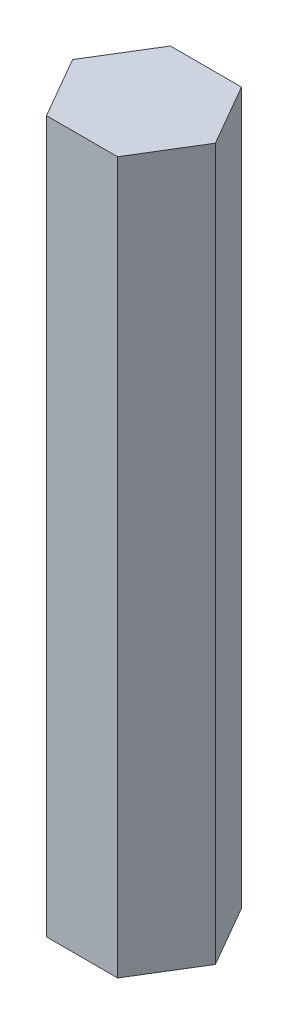
ISO-10303-21;
HEADER;
FILE_DESCRIPTION(('STEP AP214'),'2;1');
FILE_NAME('part.step','',(''),(''),'','','');
FILE_SCHEMA(('AUTOMOTIVE_DESIGN { 1 0 10303 214 1 1 1 1 }'));
ENDSEC;
DATA;
#1=APPLICATION_CONTEXT('core data for automotive mechanical design processes');
#2=APPLICATION_PROTOCOL_DEFINITION('international standard','automotive_design',2000,#1);
#3=PRODUCT_CONTEXT('',#1,'mechanical');
#4=PRODUCT('Part','Part','',(#3));
#5=PRODUCT_RELATED_PRODUCT_CATEGORY('part','',(#4));
#6=PRODUCT_DEFINITION_FORMATION('','',#4);
#7=PRODUCT_DEFINITION_CONTEXT('part definition',#1,'design');
#8=PRODUCT_DEFINITION('design','',#6,#7);
#9=PRODUCT_DEFINITION_SHAPE('','',#8);
#10=(LENGTH_UNIT() NAMED_UNIT(*) SI_UNIT(.MILLI.,.METRE.));
#11=(NAMED_UNIT(*) PLANE_ANGLE_UNIT() SI_UNIT($,.RADIAN.));
#12=(NAMED_UNIT(*) SI_UNIT($,.STERADIAN.) SOLID_ANGLE_UNIT());
#13=UNCERTAINTY_MEASURE_WITH_UNIT(LENGTH_MEASURE(1.E-05),#10,'distance_accuracy_value','');
#14=(GEOMETRIC_REPRESENTATION_CONTEXT(3) GLOBAL_UNCERTAINTY_ASSIGNED_CONTEXT((#13)) GLOBAL_UNIT_ASSIGNED_CONTEXT((#10,
#11,#12)) REPRESENTATION_CONTEXT('',''));
#15=CARTESIAN_POINT('',(0.,0.,0.));
#16=DIRECTION('',(0.,0.,1.));
#17=DIRECTION('',(1.,0.,0.));
#18=AXIS2_PLACEMENT_3D('',#15,#16,#17);
#19=CARTESIAN_POINT('',(-1.24930613372395,25.,-2.1654639651215));
#20=DIRECTION('',(0.8661855860486,0.,-0.499722453489578));
#21=DIRECTION('',(-0.499722453489578,0.,-0.8661855860486));
#22=AXIS2_PLACEMENT_3D('',#19,#20,#21);
#23=PLANE('',#22);
#24=DIRECTION('',(0.499722453489578,0.,0.8661855860486));
#25=VECTOR('',#24,1.);
#26=CARTESIAN_POINT('',(-1.24930613372395,0.,-2.1654639651215));
#27=LINE('',#26,#25);
#28=CARTESIAN_POINT('',(-1.24930613372395,0.,-2.1654639651215));
#29=VERTEX_POINT('',#28);
#30=CARTESIAN_POINT('',(0.,0.,0.));
#31=VERTEX_POINT('',#30);
#32=EDGE_CURVE('E119',#29,#31,#27,.T.);
#33=ORIENTED_EDGE('',*,*,#32,.T.);
#34=DIRECTION('',(0.,-1.,0.));
#35=VECTOR('',#34,1.);
#36=CARTESIAN_POINT('',(0.,25.,0.));
#37=LINE('',#36,#35);
#38=CARTESIAN_POINT('',(0.,25.,0.));
#39=VERTEX_POINT('',#38);
#40=EDGE_CURVE('E11',#39,#31,#37,.T.);
#41=ORIENTED_EDGE('',*,*,#40,.F.);
#42=DIRECTION('',(0.499722453489578,0.,0.8661855860486));
#43=VECTOR('',#42,1.);
#44=CARTESIAN_POINT('',(-1.24930613372395,25.,-2.1654639651215));
#45=LINE('',#44,#43);
#46=CARTESIAN_POINT('',(-1.24930613372395,25.,-2.1654639651215));
#47=VERTEX_POINT('',#46);
#48=EDGE_CURVE('E129',#47,#39,#45,.T.);
#49=ORIENTED_EDGE('',*,*,#48,.F.);
#50=DIRECTION('',(0.,-1.,0.));
#51=VECTOR('',#50,1.);
#52=CARTESIAN_POINT('',(-1.24930613372395,25.,-2.1654639651215));
#53=LINE('',#52,#51);
#54=EDGE_CURVE('E115',#47,#29,#53,.T.);
#55=ORIENTED_EDGE('',*,*,#54,.T.);
#56=EDGE_LOOP('',(#33,#41,#49,#55));
#57=FACE_BOUND('',#56,.T.);
#58=ADVANCED_FACE('F35',(#57),#23,.F.);
#59=CARTESIAN_POINT('',(0.,25.,0.));
#60=DIRECTION('',(0.,0.,-1.));
#61=DIRECTION('',(-1.,0.,0.));
#62=AXIS2_PLACEMENT_3D('',#59,#60,#61);
#63=PLANE('',#62);
#64=DIRECTION('',(1.,0.,0.));
#65=VECTOR('',#64,1.);
#66=CARTESIAN_POINT('',(0.,0.,0.));
#67=LINE('',#66,#65);
#68=CARTESIAN_POINT('',(2.5,0.,0.));
#69=VERTEX_POINT('',#68);
#70=EDGE_CURVE('E122',#31,#69,#67,.T.);
#71=ORIENTED_EDGE('',*,*,#70,.T.);
#72=DIRECTION('',(0.,-1.,0.));
#73=VECTOR('',#72,1.);
#74=CARTESIAN_POINT('',(2.5,25.,0.));
#75=LINE('',#74,#73);
#76=CARTESIAN_POINT('',(2.5,25.,0.));
#77=VERTEX_POINT('',#76);
#78=EDGE_CURVE('E43',#77,#69,#75,.T.);
#79=ORIENTED_EDGE('',*,*,#78,.F.);
#80=DIRECTION('',(1.,0.,0.));
#81=VECTOR('',#80,1.);
#82=CARTESIAN_POINT('',(0.,25.,0.));
#83=LINE('',#82,#81);
#84=EDGE_CURVE('E88',#39,#77,#83,.T.);
#85=ORIENTED_EDGE('',*,*,#84,.F.);
#86=ORIENTED_EDGE('',*,*,#40,.T.);
#87=EDGE_LOOP('',(#71,#79,#85,#86));
#88=FACE_BOUND('',#87,.T.);
#89=ADVANCED_FACE('F153',(#88),#63,.F.);
#90=CARTESIAN_POINT('',(2.5,25.,0.));
#91=DIRECTION('',(-0.852851304076264,0.,-0.522153859638532));
#92=DIRECTION('',(-0.522153859638532,0.,0.852851304076264));
#93=AXIS2_PLACEMENT_3D('',#90,#91,#92);
#94=PLANE('',#93);
#95=DIRECTION('',(0.522153859638532,0.,-0.852851304076264));
#96=VECTOR('',#95,1.);
#97=CARTESIAN_POINT('',(2.5,0.,0.));
#98=LINE('',#97,#96);
#99=CARTESIAN_POINT('',(3.80538464909633,0.,-2.13212826019066));
#100=VERTEX_POINT('',#99);
#101=EDGE_CURVE('E124',#69,#100,#98,.T.);
#102=ORIENTED_EDGE('',*,*,#101,.T.);
#103=DIRECTION('',(0.,-1.,0.));
#104=VECTOR('',#103,1.);
#105=CARTESIAN_POINT('',(3.80538464909633,25.,-2.13212826019066));
#106=LINE('',#105,#104);
#107=CARTESIAN_POINT('',(3.80538464909633,25.,-2.13212826019066));
#108=VERTEX_POINT('',#107);
#109=EDGE_CURVE('E110',#108,#100,#106,.T.);
#110=ORIENTED_EDGE('',*,*,#109,.F.);
#111=DIRECTION('',(0.522153859638532,0.,-0.852851304076264));
#112=VECTOR('',#111,1.);
#113=CARTESIAN_POINT('',(2.5,25.,0.));
#114=LINE('',#113,#112);
#115=EDGE_CURVE('E101',#77,#108,#114,.T.);
#116=ORIENTED_EDGE('',*,*,#115,.F.);
#117=ORIENTED_EDGE('',*,*,#78,.T.);
#118=EDGE_LOOP('',(#102,#110,#116,#117));
#119=FACE_BOUND('',#118,.T.);
#120=ADVANCED_FACE('F135',(#119),#94,.F.);
#121=CARTESIAN_POINT('',(3.80538464909633,25.,-2.13212826019066));
#122=DIRECTION('',(-0.8661855860486,0.,0.499722453489579));
#123=DIRECTION('',(0.499722453489578,0.,0.8661855860486));
#124=AXIS2_PLACEMENT_3D('',#121,#122,#123);
#125=PLANE('',#124);
#126=DIRECTION('',(-0.499722453489578,0.,-0.8661855860486));
#127=VECTOR('',#126,1.);
#128=CARTESIAN_POINT('',(3.80538464909633,0.,-2.13212826019066));
#129=LINE('',#128,#127);
#130=CARTESIAN_POINT('',(2.55607851537238,0.,-4.29759222531216));
#131=VERTEX_POINT('',#130);
#132=EDGE_CURVE('E109',#100,#131,#129,.T.);
#133=ORIENTED_EDGE('',*,*,#132,.T.);
#134=DIRECTION('',(0.,-1.,0.));
#135=VECTOR('',#134,1.);
#136=CARTESIAN_POINT('',(2.55607851537238,25.,-4.29759222531216));
#137=LINE('',#136,#135);
#138=CARTESIAN_POINT('',(2.55607851537238,25.,-4.29759222531216));
#139=VERTEX_POINT('',#138);
#140=EDGE_CURVE('E106',#139,#131,#137,.T.);
#141=ORIENTED_EDGE('',*,*,#140,.F.);
#142=DIRECTION('',(-0.499722453489578,0.,-0.8661855860486));
#143=VECTOR('',#142,1.);
#144=CARTESIAN_POINT('',(3.80538464909633,25.,-2.13212826019066));
#145=LINE('',#144,#143);
#146=EDGE_CURVE('E95',#108,#139,#145,.T.);
#147=ORIENTED_EDGE('',*,*,#146,.F.);
#148=ORIENTED_EDGE('',*,*,#109,.T.);
#149=EDGE_LOOP('',(#133,#141,#147,#148));
#150=FACE_BOUND('',#149,.T.);
#151=ADVANCED_FACE('F107',(#150),#125,.F.);
#152=CARTESIAN_POINT('',(2.55607851537238,25.,-4.29759222531216));
#153=DIRECTION('',(0.,0.,1.));
#154=DIRECTION('',(1.,0.,0.));
#155=AXIS2_PLACEMENT_3D('',#152,#153,#154);
#156=PLANE('',#155);
#157=DIRECTION('',(-1.,0.,0.));
#158=VECTOR('',#157,1.);
#159=CARTESIAN_POINT('',(2.55607851537238,0.,-4.29759222531216));
#160=LINE('',#159,#158);
#161=CARTESIAN_POINT('',(0.0560785153723843,0.,-4.29759222531216));
#162=VERTEX_POINT('',#161);
#163=EDGE_CURVE('E74',#131,#162,#160,.T.);
#164=ORIENTED_EDGE('',*,*,#163,.T.);
#165=DIRECTION('',(0.,-1.,0.));
#166=VECTOR('',#165,1.);
#167=CARTESIAN_POINT('',(0.0560785153723843,25.,-4.29759222531216));
#168=LINE('',#167,#166);
#169=CARTESIAN_POINT('',(0.0560785153723843,25.,-4.29759222531216));
#170=VERTEX_POINT('',#169);
#171=EDGE_CURVE('E111',#170,#162,#168,.T.);
#172=ORIENTED_EDGE('',*,*,#171,.F.);
#173=DIRECTION('',(-1.,0.,0.));
#174=VECTOR('',#173,1.);
#175=CARTESIAN_POINT('',(2.55607851537238,25.,-4.29759222531216));
#176=LINE('',#175,#174);
#177=EDGE_CURVE('E99',#139,#170,#176,.T.);
#178=ORIENTED_EDGE('',*,*,#177,.F.);
#179=ORIENTED_EDGE('',*,*,#140,.T.);
#180=EDGE_LOOP('',(#164,#172,#178,#179));
#181=FACE_BOUND('',#180,.T.);
#182=ADVANCED_FACE('F113',(#181),#156,.F.);
#183=CARTESIAN_POINT('',(0.0560785153723843,25.,-4.29759222531216));
#184=DIRECTION('',(0.852851304076264,0.,0.522153859638532));
#185=DIRECTION('',(0.522153859638532,0.,-0.852851304076264));
#186=AXIS2_PLACEMENT_3D('',#183,#184,#185);
#187=PLANE('',#186);
#188=DIRECTION('',(-0.522153859638532,0.,0.852851304076264));
#189=VECTOR('',#188,1.);
#190=CARTESIAN_POINT('',(0.0560785153723843,0.,-4.29759222531216));
#191=LINE('',#190,#189);
#192=EDGE_CURVE('E80',#162,#29,#191,.T.);
#193=ORIENTED_EDGE('',*,*,#192,.T.);
#194=ORIENTED_EDGE('',*,*,#54,.F.);
#195=DIRECTION('',(-0.522153859638532,0.,0.852851304076264));
#196=VECTOR('',#195,1.);
#197=CARTESIAN_POINT('',(0.0560785153723843,25.,-4.29759222531216));
#198=LINE('',#197,#196);
#199=EDGE_CURVE('E51',#170,#47,#198,.T.);
#200=ORIENTED_EDGE('',*,*,#199,.F.);
#201=ORIENTED_EDGE('',*,*,#171,.T.);
#202=EDGE_LOOP('',(#193,#194,#200,#201));
#203=FACE_BOUND('',#202,.T.);
#204=ADVANCED_FACE('F142',(#203),#187,.F.);
#205=CARTESIAN_POINT('',(0.,25.,0.));
#206=DIRECTION('',(0.,1.,0.));
#207=DIRECTION('',(0.,0.,1.));
#208=AXIS2_PLACEMENT_3D('',#205,#206,#207);
#209=PLANE('',#208);
#210=ORIENTED_EDGE('',*,*,#48,.T.);
#211=ORIENTED_EDGE('',*,*,#84,.T.);
#212=ORIENTED_EDGE('',*,*,#115,.T.);
#213=ORIENTED_EDGE('',*,*,#146,.T.);
#214=ORIENTED_EDGE('',*,*,#177,.T.);
#215=ORIENTED_EDGE('',*,*,#199,.T.);
#216=EDGE_LOOP('',(#210,#211,#212,#213,#214,#215));
#217=FACE_BOUND('',#216,.T.);
#218=ADVANCED_FACE('F97',(#217),#209,.T.);
#219=CARTESIAN_POINT('',(0.,0.,0.));
#220=DIRECTION('',(0.,1.,0.));
#221=DIRECTION('',(0.,0.,1.));
#222=AXIS2_PLACEMENT_3D('',#219,#220,#221);
#223=PLANE('',#222);
#224=ORIENTED_EDGE('',*,*,#32,.F.);
#225=ORIENTED_EDGE('',*,*,#192,.F.);
#226=ORIENTED_EDGE('',*,*,#163,.F.);
#227=ORIENTED_EDGE('',*,*,#132,.F.);
#228=ORIENTED_EDGE('',*,*,#101,.F.);
#229=ORIENTED_EDGE('',*,*,#70,.F.);
#230=EDGE_LOOP('',(#224,#225,#226,#227,#228,#229));
#231=FACE_BOUND('',#230,.T.);
#232=ADVANCED_FACE('F138',(#231),#223,.F.);
#233=CLOSED_SHELL('',(#58,#89,#120,#151,#182,#204,#218,#232));
#234=MANIFOLD_SOLID_BREP('B2',#233);
#235=ADVANCED_BREP_SHAPE_REPRESENTATION('',(#18,#234),#14);
#236=SHAPE_DEFINITION_REPRESENTATION(#9,#235);
ENDSEC;
END-ISO-10303-21;
